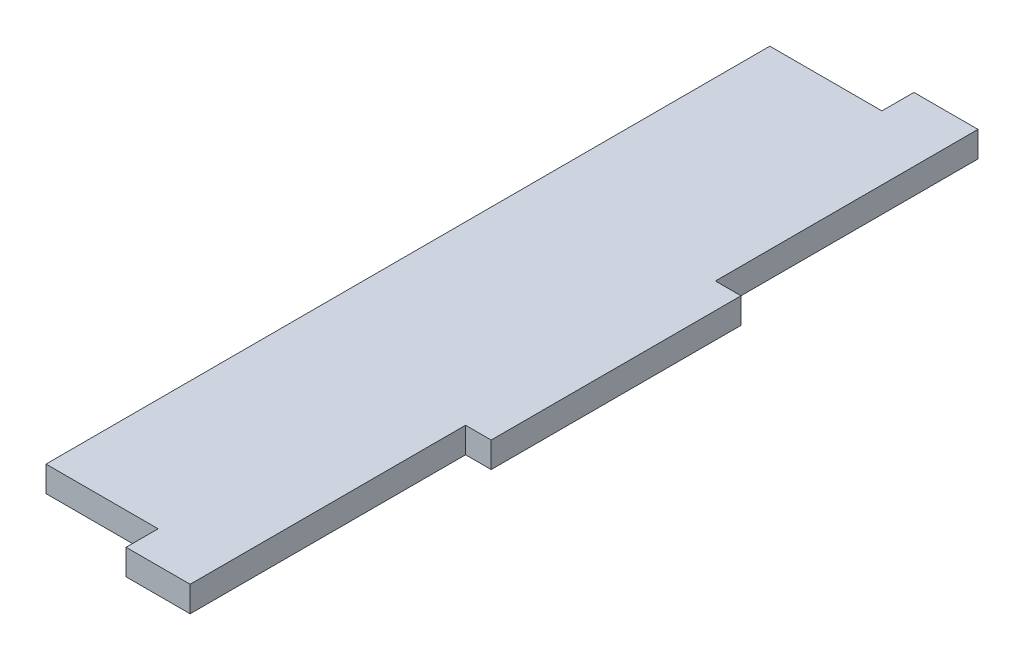
ISO-10303-21;
HEADER;
FILE_DESCRIPTION(('STEP AP214'),'2;1');
FILE_NAME('part.step','',(''),(''),'','','');
FILE_SCHEMA(('AUTOMOTIVE_DESIGN { 1 0 10303 214 1 1 1 1 }'));
ENDSEC;
DATA;
#1=APPLICATION_CONTEXT('core data for automotive mechanical design processes');
#2=APPLICATION_PROTOCOL_DEFINITION('international standard','automotive_design',2000,#1);
#3=PRODUCT_CONTEXT('',#1,'mechanical');
#4=PRODUCT('Part','Part','',(#3));
#5=PRODUCT_RELATED_PRODUCT_CATEGORY('part','',(#4));
#6=PRODUCT_DEFINITION_FORMATION('','',#4);
#7=PRODUCT_DEFINITION_CONTEXT('part definition',#1,'design');
#8=PRODUCT_DEFINITION('design','',#6,#7);
#9=PRODUCT_DEFINITION_SHAPE('','',#8);
#10=(LENGTH_UNIT() NAMED_UNIT(*) SI_UNIT(.MILLI.,.METRE.));
#11=(NAMED_UNIT(*) PLANE_ANGLE_UNIT() SI_UNIT($,.RADIAN.));
#12=(NAMED_UNIT(*) SI_UNIT($,.STERADIAN.) SOLID_ANGLE_UNIT());
#13=UNCERTAINTY_MEASURE_WITH_UNIT(LENGTH_MEASURE(1.E-05),#10,'distance_accuracy_value','');
#14=(GEOMETRIC_REPRESENTATION_CONTEXT(3) GLOBAL_UNCERTAINTY_ASSIGNED_CONTEXT((#13)) GLOBAL_UNIT_ASSIGNED_CONTEXT((#10,
#11,#12)) REPRESENTATION_CONTEXT('',''));
#15=CARTESIAN_POINT('',(0.,0.,0.));
#16=DIRECTION('',(0.,0.,1.));
#17=DIRECTION('',(1.,0.,0.));
#18=AXIS2_PLACEMENT_3D('',#15,#16,#17);
#19=CARTESIAN_POINT('',(27.5,4.,1.));
#20=DIRECTION('',(-1.,0.,0.));
#21=DIRECTION('',(0.,0.,1.));
#22=AXIS2_PLACEMENT_3D('',#19,#20,#21);
#23=PLANE('',#22);
#24=DIRECTION('',(0.,1.,0.));
#25=VECTOR('',#24,1.);
#26=CARTESIAN_POINT('',(27.5,0.,-77.));
#27=LINE('',#26,#25);
#28=CARTESIAN_POINT('',(27.5,0.,-77.));
#29=VERTEX_POINT('',#28);
#30=CARTESIAN_POINT('',(27.5,4.,-77.));
#31=VERTEX_POINT('',#30);
#32=EDGE_CURVE('E208',#29,#31,#27,.T.);
#33=ORIENTED_EDGE('',*,*,#32,.F.);
#34=DIRECTION('',(0.,0.,-1.));
#35=VECTOR('',#34,1.);
#36=CARTESIAN_POINT('',(27.5,0.,1.));
#37=LINE('',#36,#35);
#38=CARTESIAN_POINT('',(27.5,0.,-118.));
#39=VERTEX_POINT('',#38);
#40=EDGE_CURVE('E156',#29,#39,#37,.T.);
#41=ORIENTED_EDGE('',*,*,#40,.T.);
#42=DIRECTION('',(0.,1.,0.));
#43=VECTOR('',#42,1.);
#44=CARTESIAN_POINT('',(27.5,0.,-118.));
#45=LINE('',#44,#43);
#46=CARTESIAN_POINT('',(27.5,4.,-118.));
#47=VERTEX_POINT('',#46);
#48=EDGE_CURVE('E199',#39,#47,#45,.T.);
#49=ORIENTED_EDGE('',*,*,#48,.T.);
#50=DIRECTION('',(0.,0.,-1.));
#51=VECTOR('',#50,1.);
#52=CARTESIAN_POINT('',(27.5,4.,1.));
#53=LINE('',#52,#51);
#54=EDGE_CURVE('E187',#31,#47,#53,.T.);
#55=ORIENTED_EDGE('',*,*,#54,.F.);
#56=EDGE_LOOP('',(#33,#41,#49,#55));
#57=FACE_BOUND('',#56,.T.);
#58=ADVANCED_FACE('F33',(#57),#23,.F.);
#59=CARTESIAN_POINT('',(0.,4.,0.));
#60=DIRECTION('',(1.,0.,0.));
#61=DIRECTION('',(0.,0.,-1.));
#62=AXIS2_PLACEMENT_3D('',#59,#60,#61);
#63=PLANE('',#62);
#64=DIRECTION('',(0.,0.,1.));
#65=VECTOR('',#64,1.);
#66=CARTESIAN_POINT('',(0.,0.,0.));
#67=LINE('',#66,#65);
#68=CARTESIAN_POINT('',(0.,0.,-113.));
#69=VERTEX_POINT('',#68);
#70=CARTESIAN_POINT('',(0.,0.,0.));
#71=VERTEX_POINT('',#70);
#72=EDGE_CURVE('E178',#69,#71,#67,.T.);
#73=ORIENTED_EDGE('',*,*,#72,.T.);
#74=DIRECTION('',(0.,-1.,0.));
#75=VECTOR('',#74,1.);
#76=CARTESIAN_POINT('',(0.,4.,0.));
#77=LINE('',#76,#75);
#78=CARTESIAN_POINT('',(0.,4.,0.));
#79=VERTEX_POINT('',#78);
#80=EDGE_CURVE('E11',#79,#71,#77,.T.);
#81=ORIENTED_EDGE('',*,*,#80,.F.);
#82=DIRECTION('',(0.,0.,1.));
#83=VECTOR('',#82,1.);
#84=CARTESIAN_POINT('',(0.,4.,0.));
#85=LINE('',#84,#83);
#86=CARTESIAN_POINT('',(0.,4.,-113.));
#87=VERTEX_POINT('',#86);
#88=EDGE_CURVE('E164',#87,#79,#85,.T.);
#89=ORIENTED_EDGE('',*,*,#88,.F.);
#90=DIRECTION('',(0.,-1.,0.));
#91=VECTOR('',#90,1.);
#92=CARTESIAN_POINT('',(0.,4.,-113.));
#93=LINE('',#92,#91);
#94=EDGE_CURVE('E165',#87,#69,#93,.T.);
#95=ORIENTED_EDGE('',*,*,#94,.T.);
#96=EDGE_LOOP('',(#73,#81,#89,#95));
#97=FACE_BOUND('',#96,.T.);
#98=ADVANCED_FACE('F35',(#97),#63,.F.);
#99=CARTESIAN_POINT('',(0.,4.,0.));
#100=DIRECTION('',(0.,0.,-1.));
#101=DIRECTION('',(-1.,0.,0.));
#102=AXIS2_PLACEMENT_3D('',#99,#100,#101);
#103=PLANE('',#102);
#104=DIRECTION('',(1.,0.,0.));
#105=VECTOR('',#104,1.);
#106=CARTESIAN_POINT('',(0.,0.,0.));
#107=LINE('',#106,#105);
#108=CARTESIAN_POINT('',(17.5,0.,0.));
#109=VERTEX_POINT('',#108);
#110=EDGE_CURVE('E176',#71,#109,#107,.T.);
#111=ORIENTED_EDGE('',*,*,#110,.T.);
#112=DIRECTION('',(0.,-1.,0.));
#113=VECTOR('',#112,1.);
#114=CARTESIAN_POINT('',(17.5,4.,0.));
#115=LINE('',#114,#113);
#116=CARTESIAN_POINT('',(17.5,4.,0.));
#117=VERTEX_POINT('',#116);
#118=EDGE_CURVE('E41',#117,#109,#115,.T.);
#119=ORIENTED_EDGE('',*,*,#118,.F.);
#120=DIRECTION('',(1.,0.,0.));
#121=VECTOR('',#120,1.);
#122=CARTESIAN_POINT('',(0.,4.,0.));
#123=LINE('',#122,#121);
#124=EDGE_CURVE('E85',#79,#117,#123,.T.);
#125=ORIENTED_EDGE('',*,*,#124,.F.);
#126=ORIENTED_EDGE('',*,*,#80,.T.);
#127=EDGE_LOOP('',(#111,#119,#125,#126));
#128=FACE_BOUND('',#127,.T.);
#129=ADVANCED_FACE('F255',(#128),#103,.F.);
#130=CARTESIAN_POINT('',(17.5,4.,1.));
#131=DIRECTION('',(1.,0.,0.));
#132=DIRECTION('',(0.,0.,-1.));
#133=AXIS2_PLACEMENT_3D('',#130,#131,#132);
#134=PLANE('',#133);
#135=DIRECTION('',(0.,0.,1.));
#136=VECTOR('',#135,1.);
#137=CARTESIAN_POINT('',(17.5,0.,1.));
#138=LINE('',#137,#136);
#139=CARTESIAN_POINT('',(17.5,0.,5.));
#140=VERTEX_POINT('',#139);
#141=EDGE_CURVE('E159',#109,#140,#138,.T.);
#142=ORIENTED_EDGE('',*,*,#141,.T.);
#143=DIRECTION('',(0.,1.,0.));
#144=VECTOR('',#143,1.);
#145=CARTESIAN_POINT('',(17.5,0.,5.));
#146=LINE('',#145,#144);
#147=CARTESIAN_POINT('',(17.5,4.,5.));
#148=VERTEX_POINT('',#147);
#149=EDGE_CURVE('E191',#140,#148,#146,.T.);
#150=ORIENTED_EDGE('',*,*,#149,.T.);
#151=DIRECTION('',(0.,0.,1.));
#152=VECTOR('',#151,1.);
#153=CARTESIAN_POINT('',(17.5,4.,1.));
#154=LINE('',#153,#152);
#155=EDGE_CURVE('E175',#117,#148,#154,.T.);
#156=ORIENTED_EDGE('',*,*,#155,.F.);
#157=ORIENTED_EDGE('',*,*,#118,.T.);
#158=EDGE_LOOP('',(#142,#150,#156,#157));
#159=FACE_BOUND('',#158,.T.);
#160=ADVANCED_FACE('F172',(#159),#134,.F.);
#161=CARTESIAN_POINT('',(27.5,0.,5.));
#162=VERTEX_POINT('',#161);
#163=CARTESIAN_POINT('',(27.5,0.,-38.));
#164=VERTEX_POINT('',#163);
#165=EDGE_CURVE('E144',#162,#164,#37,.T.);
#166=ORIENTED_EDGE('',*,*,#165,.T.);
#167=DIRECTION('',(0.,1.,0.));
#168=VECTOR('',#167,1.);
#169=CARTESIAN_POINT('',(27.5,0.,-38.));
#170=LINE('',#169,#168);
#171=CARTESIAN_POINT('',(27.5,4.,-38.));
#172=VERTEX_POINT('',#171);
#173=EDGE_CURVE('E129',#164,#172,#170,.T.);
#174=ORIENTED_EDGE('',*,*,#173,.T.);
#175=CARTESIAN_POINT('',(27.5,4.,5.));
#176=VERTEX_POINT('',#175);
#177=EDGE_CURVE('E185',#176,#172,#53,.T.);
#178=ORIENTED_EDGE('',*,*,#177,.F.);
#179=DIRECTION('',(0.,1.,0.));
#180=VECTOR('',#179,1.);
#181=CARTESIAN_POINT('',(27.5,0.,5.));
#182=LINE('',#181,#180);
#183=EDGE_CURVE('E153',#162,#176,#182,.T.);
#184=ORIENTED_EDGE('',*,*,#183,.F.);
#185=EDGE_LOOP('',(#166,#174,#178,#184));
#186=FACE_BOUND('',#185,.T.);
#187=ADVANCED_FACE('F151',(#186),#23,.F.);
#188=CARTESIAN_POINT('',(17.5,4.,-113.));
#189=DIRECTION('',(1.,0.,0.));
#190=DIRECTION('',(0.,0.,-1.));
#191=AXIS2_PLACEMENT_3D('',#188,#189,#190);
#192=PLANE('',#191);
#193=DIRECTION('',(0.,0.,1.));
#194=VECTOR('',#193,1.);
#195=CARTESIAN_POINT('',(17.5,0.,-113.));
#196=LINE('',#195,#194);
#197=CARTESIAN_POINT('',(17.5,0.,-118.));
#198=VERTEX_POINT('',#197);
#199=CARTESIAN_POINT('',(17.5,0.,-113.));
#200=VERTEX_POINT('',#199);
#201=EDGE_CURVE('E155',#198,#200,#196,.T.);
#202=ORIENTED_EDGE('',*,*,#201,.T.);
#203=DIRECTION('',(0.,-1.,0.));
#204=VECTOR('',#203,1.);
#205=CARTESIAN_POINT('',(17.5,4.,-113.));
#206=LINE('',#205,#204);
#207=CARTESIAN_POINT('',(17.5,4.,-113.));
#208=VERTEX_POINT('',#207);
#209=EDGE_CURVE('E167',#208,#200,#206,.T.);
#210=ORIENTED_EDGE('',*,*,#209,.F.);
#211=DIRECTION('',(0.,0.,1.));
#212=VECTOR('',#211,1.);
#213=CARTESIAN_POINT('',(17.5,4.,-113.));
#214=LINE('',#213,#212);
#215=CARTESIAN_POINT('',(17.5,4.,-118.));
#216=VERTEX_POINT('',#215);
#217=EDGE_CURVE('E183',#216,#208,#214,.T.);
#218=ORIENTED_EDGE('',*,*,#217,.F.);
#219=DIRECTION('',(0.,1.,0.));
#220=VECTOR('',#219,1.);
#221=CARTESIAN_POINT('',(17.5,0.,-118.));
#222=LINE('',#221,#220);
#223=EDGE_CURVE('E197',#198,#216,#222,.T.);
#224=ORIENTED_EDGE('',*,*,#223,.F.);
#225=EDGE_LOOP('',(#202,#210,#218,#224));
#226=FACE_BOUND('',#225,.T.);
#227=ADVANCED_FACE('F260',(#226),#192,.F.);
#228=CARTESIAN_POINT('',(0.,4.,-113.));
#229=DIRECTION('',(0.,0.,1.));
#230=DIRECTION('',(1.,0.,0.));
#231=AXIS2_PLACEMENT_3D('',#228,#229,#230);
#232=PLANE('',#231);
#233=DIRECTION('',(-1.,0.,0.));
#234=VECTOR('',#233,1.);
#235=CARTESIAN_POINT('',(0.,0.,-113.));
#236=LINE('',#235,#234);
#237=EDGE_CURVE('E78',#200,#69,#236,.T.);
#238=ORIENTED_EDGE('',*,*,#237,.T.);
#239=ORIENTED_EDGE('',*,*,#94,.F.);
#240=DIRECTION('',(-1.,0.,0.));
#241=VECTOR('',#240,1.);
#242=CARTESIAN_POINT('',(0.,4.,-113.));
#243=LINE('',#242,#241);
#244=EDGE_CURVE('E57',#208,#87,#243,.T.);
#245=ORIENTED_EDGE('',*,*,#244,.F.);
#246=ORIENTED_EDGE('',*,*,#209,.T.);
#247=EDGE_LOOP('',(#238,#239,#245,#246));
#248=FACE_BOUND('',#247,.T.);
#249=ADVANCED_FACE('F265',(#248),#232,.F.);
#250=CARTESIAN_POINT('',(0.,4.,0.));
#251=DIRECTION('',(0.,-1.,0.));
#252=DIRECTION('',(0.,0.,-1.));
#253=AXIS2_PLACEMENT_3D('',#250,#251,#252);
#254=PLANE('',#253);
#255=ORIENTED_EDGE('',*,*,#88,.T.);
#256=ORIENTED_EDGE('',*,*,#124,.T.);
#257=ORIENTED_EDGE('',*,*,#155,.T.);
#258=DIRECTION('',(1.,0.,0.));
#259=VECTOR('',#258,1.);
#260=CARTESIAN_POINT('',(27.5,4.,5.));
#261=LINE('',#260,#259);
#262=EDGE_CURVE('E194',#148,#176,#261,.T.);
#263=ORIENTED_EDGE('',*,*,#262,.T.);
#264=ORIENTED_EDGE('',*,*,#177,.T.);
#265=DIRECTION('',(1.,0.,0.));
#266=VECTOR('',#265,1.);
#267=CARTESIAN_POINT('',(27.5,4.,-38.));
#268=LINE('',#267,#266);
#269=CARTESIAN_POINT('',(31.5,4.,-38.));
#270=VERTEX_POINT('',#269);
#271=EDGE_CURVE('E48',#172,#270,#268,.T.);
#272=ORIENTED_EDGE('',*,*,#271,.T.);
#273=DIRECTION('',(0.,0.,-1.));
#274=VECTOR('',#273,1.);
#275=CARTESIAN_POINT('',(31.5,4.,-77.));
#276=LINE('',#275,#274);
#277=CARTESIAN_POINT('',(31.5,4.,-77.));
#278=VERTEX_POINT('',#277);
#279=EDGE_CURVE('E217',#270,#278,#276,.T.);
#280=ORIENTED_EDGE('',*,*,#279,.T.);
#281=DIRECTION('',(-1.,0.,0.));
#282=VECTOR('',#281,1.);
#283=CARTESIAN_POINT('',(27.5,4.,-77.));
#284=LINE('',#283,#282);
#285=EDGE_CURVE('E149',#278,#31,#284,.T.);
#286=ORIENTED_EDGE('',*,*,#285,.T.);
#287=ORIENTED_EDGE('',*,*,#54,.T.);
#288=DIRECTION('',(-1.,0.,0.));
#289=VECTOR('',#288,1.);
#290=CARTESIAN_POINT('',(27.5,4.,-118.));
#291=LINE('',#290,#289);
#292=EDGE_CURVE('E205',#47,#216,#291,.T.);
#293=ORIENTED_EDGE('',*,*,#292,.T.);
#294=ORIENTED_EDGE('',*,*,#217,.T.);
#295=ORIENTED_EDGE('',*,*,#244,.T.);
#296=EDGE_LOOP('',(#255,#256,#257,#263,#264,#272,#280,#286,#287,#293,#294,#295));
#297=FACE_BOUND('',#296,.T.);
#298=ADVANCED_FACE('F235',(#297),#254,.F.);
#299=CARTESIAN_POINT('',(0.,0.,0.));
#300=DIRECTION('',(0.,-1.,0.));
#301=DIRECTION('',(0.,0.,-1.));
#302=AXIS2_PLACEMENT_3D('',#299,#300,#301);
#303=PLANE('',#302);
#304=ORIENTED_EDGE('',*,*,#72,.F.);
#305=ORIENTED_EDGE('',*,*,#237,.F.);
#306=ORIENTED_EDGE('',*,*,#201,.F.);
#307=DIRECTION('',(-1.,0.,0.));
#308=VECTOR('',#307,1.);
#309=CARTESIAN_POINT('',(27.5,0.,-118.));
#310=LINE('',#309,#308);
#311=EDGE_CURVE('E202',#39,#198,#310,.T.);
#312=ORIENTED_EDGE('',*,*,#311,.F.);
#313=ORIENTED_EDGE('',*,*,#40,.F.);
#314=DIRECTION('',(-1.,0.,0.));
#315=VECTOR('',#314,1.);
#316=CARTESIAN_POINT('',(27.5,0.,-77.));
#317=LINE('',#316,#315);
#318=CARTESIAN_POINT('',(31.5,0.,-77.));
#319=VERTEX_POINT('',#318);
#320=EDGE_CURVE('E137',#319,#29,#317,.T.);
#321=ORIENTED_EDGE('',*,*,#320,.F.);
#322=DIRECTION('',(0.,0.,-1.));
#323=VECTOR('',#322,1.);
#324=CARTESIAN_POINT('',(31.5,0.,-77.));
#325=LINE('',#324,#323);
#326=CARTESIAN_POINT('',(31.5,0.,-38.));
#327=VERTEX_POINT('',#326);
#328=EDGE_CURVE('E148',#327,#319,#325,.T.);
#329=ORIENTED_EDGE('',*,*,#328,.F.);
#330=DIRECTION('',(1.,0.,0.));
#331=VECTOR('',#330,1.);
#332=CARTESIAN_POINT('',(27.5,0.,-38.));
#333=LINE('',#332,#331);
#334=EDGE_CURVE('E132',#164,#327,#333,.T.);
#335=ORIENTED_EDGE('',*,*,#334,.F.);
#336=ORIENTED_EDGE('',*,*,#165,.F.);
#337=DIRECTION('',(1.,0.,0.));
#338=VECTOR('',#337,1.);
#339=CARTESIAN_POINT('',(27.5,0.,5.));
#340=LINE('',#339,#338);
#341=EDGE_CURVE('E177',#140,#162,#340,.T.);
#342=ORIENTED_EDGE('',*,*,#341,.F.);
#343=ORIENTED_EDGE('',*,*,#141,.F.);
#344=ORIENTED_EDGE('',*,*,#110,.F.);
#345=EDGE_LOOP('',(#304,#305,#306,#312,#313,#321,#329,#335,#336,#342,#343,#344));
#346=FACE_BOUND('',#345,.T.);
#347=ADVANCED_FACE('F142',(#346),#303,.T.);
#348=CARTESIAN_POINT('',(27.5,0.,5.));
#349=DIRECTION('',(0.,0.,1.));
#350=DIRECTION('',(1.,0.,0.));
#351=AXIS2_PLACEMENT_3D('',#348,#349,#350);
#352=PLANE('',#351);
#353=ORIENTED_EDGE('',*,*,#262,.F.);
#354=ORIENTED_EDGE('',*,*,#149,.F.);
#355=ORIENTED_EDGE('',*,*,#341,.T.);
#356=ORIENTED_EDGE('',*,*,#183,.T.);
#357=EDGE_LOOP('',(#353,#354,#355,#356));
#358=FACE_BOUND('',#357,.T.);
#359=ADVANCED_FACE('F238',(#358),#352,.T.);
#360=CARTESIAN_POINT('',(27.5,0.,-118.));
#361=DIRECTION('',(0.,0.,-1.));
#362=DIRECTION('',(-1.,0.,0.));
#363=AXIS2_PLACEMENT_3D('',#360,#361,#362);
#364=PLANE('',#363);
#365=ORIENTED_EDGE('',*,*,#292,.F.);
#366=ORIENTED_EDGE('',*,*,#48,.F.);
#367=ORIENTED_EDGE('',*,*,#311,.T.);
#368=ORIENTED_EDGE('',*,*,#223,.T.);
#369=EDGE_LOOP('',(#365,#366,#367,#368));
#370=FACE_BOUND('',#369,.T.);
#371=ADVANCED_FACE('F240',(#370),#364,.T.);
#372=CARTESIAN_POINT('',(27.5,0.,-77.));
#373=DIRECTION('',(0.,0.,-1.));
#374=DIRECTION('',(-1.,0.,0.));
#375=AXIS2_PLACEMENT_3D('',#372,#373,#374);
#376=PLANE('',#375);
#377=ORIENTED_EDGE('',*,*,#285,.F.);
#378=DIRECTION('',(0.,1.,0.));
#379=VECTOR('',#378,1.);
#380=CARTESIAN_POINT('',(31.5,0.,-77.));
#381=LINE('',#380,#379);
#382=EDGE_CURVE('E212',#319,#278,#381,.T.);
#383=ORIENTED_EDGE('',*,*,#382,.F.);
#384=ORIENTED_EDGE('',*,*,#320,.T.);
#385=ORIENTED_EDGE('',*,*,#32,.T.);
#386=EDGE_LOOP('',(#377,#383,#384,#385));
#387=FACE_BOUND('',#386,.T.);
#388=ADVANCED_FACE('F230',(#387),#376,.T.);
#389=CARTESIAN_POINT('',(31.5,0.,-77.));
#390=DIRECTION('',(1.,0.,0.));
#391=DIRECTION('',(0.,0.,-1.));
#392=AXIS2_PLACEMENT_3D('',#389,#390,#391);
#393=PLANE('',#392);
#394=ORIENTED_EDGE('',*,*,#279,.F.);
#395=DIRECTION('',(0.,1.,0.));
#396=VECTOR('',#395,1.);
#397=CARTESIAN_POINT('',(31.5,0.,-38.));
#398=LINE('',#397,#396);
#399=EDGE_CURVE('E136',#327,#270,#398,.T.);
#400=ORIENTED_EDGE('',*,*,#399,.F.);
#401=ORIENTED_EDGE('',*,*,#328,.T.);
#402=ORIENTED_EDGE('',*,*,#382,.T.);
#403=EDGE_LOOP('',(#394,#400,#401,#402));
#404=FACE_BOUND('',#403,.T.);
#405=ADVANCED_FACE('F224',(#404),#393,.T.);
#406=CARTESIAN_POINT('',(27.5,0.,-38.));
#407=DIRECTION('',(0.,0.,1.));
#408=DIRECTION('',(1.,0.,0.));
#409=AXIS2_PLACEMENT_3D('',#406,#407,#408);
#410=PLANE('',#409);
#411=ORIENTED_EDGE('',*,*,#271,.F.);
#412=ORIENTED_EDGE('',*,*,#173,.F.);
#413=ORIENTED_EDGE('',*,*,#334,.T.);
#414=ORIENTED_EDGE('',*,*,#399,.T.);
#415=EDGE_LOOP('',(#411,#412,#413,#414));
#416=FACE_BOUND('',#415,.T.);
#417=ADVANCED_FACE('F131',(#416),#410,.T.);
#418=CLOSED_SHELL('',(#58,#98,#129,#160,#187,#227,#249,#298,#347,#359,#371,#388,#405,#417));
#419=MANIFOLD_SOLID_BREP('B2',#418);
#420=ADVANCED_BREP_SHAPE_REPRESENTATION('',(#18,#419),#14);
#421=SHAPE_DEFINITION_REPRESENTATION(#9,#420);
ENDSEC;
END-ISO-10303-21;
